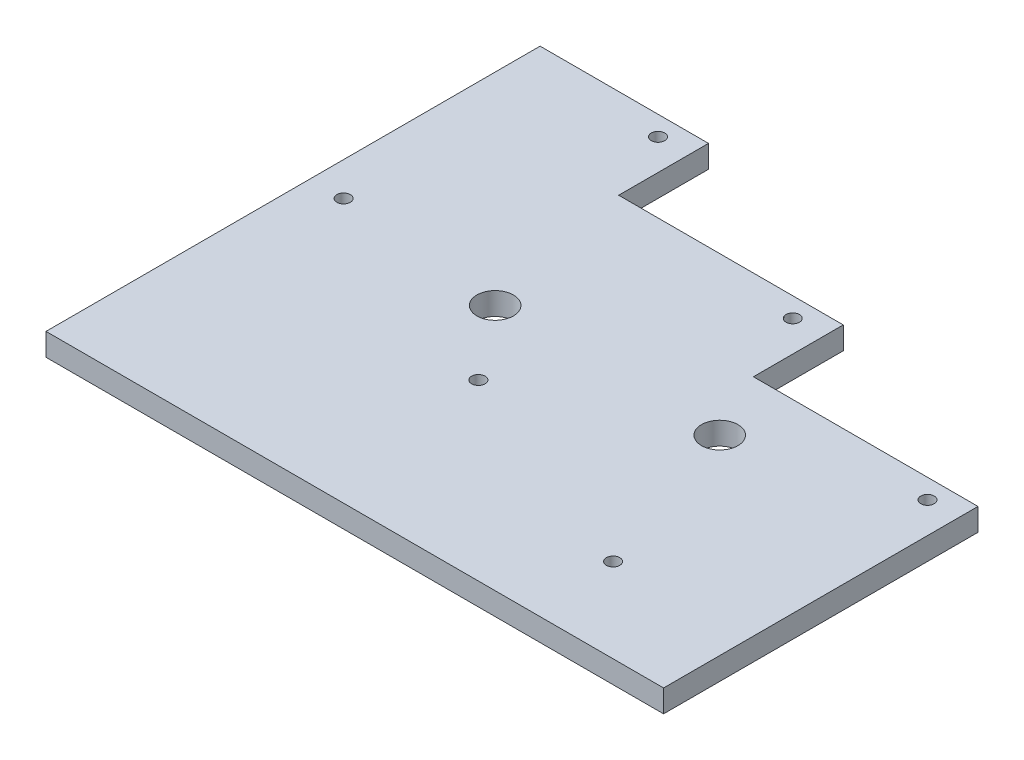
ISO-10303-21;
HEADER;
FILE_DESCRIPTION(('STEP AP214'),'2;1');
FILE_NAME('part.step','',(''),(''),'','','');
FILE_SCHEMA(('AUTOMOTIVE_DESIGN { 1 0 10303 214 1 1 1 1 }'));
ENDSEC;
DATA;
#1=APPLICATION_CONTEXT('core data for automotive mechanical design processes');
#2=APPLICATION_PROTOCOL_DEFINITION('international standard','automotive_design',2000,#1);
#3=PRODUCT_CONTEXT('',#1,'mechanical');
#4=PRODUCT('Part','Part','',(#3));
#5=PRODUCT_RELATED_PRODUCT_CATEGORY('part','',(#4));
#6=PRODUCT_DEFINITION_FORMATION('','',#4);
#7=PRODUCT_DEFINITION_CONTEXT('part definition',#1,'design');
#8=PRODUCT_DEFINITION('design','',#6,#7);
#9=PRODUCT_DEFINITION_SHAPE('','',#8);
#10=(LENGTH_UNIT() NAMED_UNIT(*) SI_UNIT(.MILLI.,.METRE.));
#11=(NAMED_UNIT(*) PLANE_ANGLE_UNIT() SI_UNIT($,.RADIAN.));
#12=(NAMED_UNIT(*) SI_UNIT($,.STERADIAN.) SOLID_ANGLE_UNIT());
#13=UNCERTAINTY_MEASURE_WITH_UNIT(LENGTH_MEASURE(1.E-05),#10,'distance_accuracy_value','');
#14=(GEOMETRIC_REPRESENTATION_CONTEXT(3) GLOBAL_UNCERTAINTY_ASSIGNED_CONTEXT((#13)) GLOBAL_UNIT_ASSIGNED_CONTEXT((#10,
#11,#12)) REPRESENTATION_CONTEXT('',''));
#15=CARTESIAN_POINT('',(0.,0.,0.));
#16=DIRECTION('',(0.,0.,1.));
#17=DIRECTION('',(1.,0.,0.));
#18=AXIS2_PLACEMENT_3D('',#15,#16,#17);
#19=CARTESIAN_POINT('',(-87.3125,3.175,-69.85));
#20=DIRECTION('',(1.,0.,0.));
#21=DIRECTION('',(0.,0.,-1.));
#22=AXIS2_PLACEMENT_3D('',#19,#20,#21);
#23=PLANE('',#22);
#24=DIRECTION('',(0.,0.,1.));
#25=VECTOR('',#24,1.);
#26=CARTESIAN_POINT('',(-87.3125,-3.175,-69.85));
#27=LINE('',#26,#25);
#28=CARTESIAN_POINT('',(-87.3125,-3.175,-69.85));
#29=VERTEX_POINT('',#28);
#30=CARTESIAN_POINT('',(-87.3125,-3.175,69.85));
#31=VERTEX_POINT('',#30);
#32=EDGE_CURVE('E141',#29,#31,#27,.T.);
#33=ORIENTED_EDGE('',*,*,#32,.T.);
#34=DIRECTION('',(0.,-1.,0.));
#35=VECTOR('',#34,1.);
#36=CARTESIAN_POINT('',(-87.3125,3.175,69.85));
#37=LINE('',#36,#35);
#38=CARTESIAN_POINT('',(-87.3125,3.175,69.85));
#39=VERTEX_POINT('',#38);
#40=EDGE_CURVE('E11',#39,#31,#37,.T.);
#41=ORIENTED_EDGE('',*,*,#40,.F.);
#42=DIRECTION('',(0.,0.,1.));
#43=VECTOR('',#42,1.);
#44=CARTESIAN_POINT('',(-87.3125,3.175,-69.85));
#45=LINE('',#44,#43);
#46=CARTESIAN_POINT('',(-87.3125,3.175,-69.85));
#47=VERTEX_POINT('',#46);
#48=EDGE_CURVE('E156',#47,#39,#45,.T.);
#49=ORIENTED_EDGE('',*,*,#48,.F.);
#50=DIRECTION('',(0.,-1.,0.));
#51=VECTOR('',#50,1.);
#52=CARTESIAN_POINT('',(-87.3125,3.175,-69.85));
#53=LINE('',#52,#51);
#54=EDGE_CURVE('E137',#47,#29,#53,.T.);
#55=ORIENTED_EDGE('',*,*,#54,.T.);
#56=EDGE_LOOP('',(#33,#41,#49,#55));
#57=FACE_BOUND('',#56,.T.);
#58=ADVANCED_FACE('F43',(#57),#23,.F.);
#59=CARTESIAN_POINT('',(-87.3125,3.175,69.85));
#60=DIRECTION('',(0.,0.,-1.));
#61=DIRECTION('',(-1.,0.,0.));
#62=AXIS2_PLACEMENT_3D('',#59,#60,#61);
#63=PLANE('',#62);
#64=DIRECTION('',(1.,0.,0.));
#65=VECTOR('',#64,1.);
#66=CARTESIAN_POINT('',(-87.3125,-3.175,69.85));
#67=LINE('',#66,#65);
#68=CARTESIAN_POINT('',(87.3125,-3.175,69.85));
#69=VERTEX_POINT('',#68);
#70=EDGE_CURVE('E144',#31,#69,#67,.T.);
#71=ORIENTED_EDGE('',*,*,#70,.T.);
#72=DIRECTION('',(0.,-1.,0.));
#73=VECTOR('',#72,1.);
#74=CARTESIAN_POINT('',(87.3125,3.175,69.85));
#75=LINE('',#74,#73);
#76=CARTESIAN_POINT('',(87.3125,3.175,69.85));
#77=VERTEX_POINT('',#76);
#78=EDGE_CURVE('E52',#77,#69,#75,.T.);
#79=ORIENTED_EDGE('',*,*,#78,.F.);
#80=DIRECTION('',(1.,0.,0.));
#81=VECTOR('',#80,1.);
#82=CARTESIAN_POINT('',(-87.3125,3.175,69.85));
#83=LINE('',#82,#81);
#84=EDGE_CURVE('E104',#39,#77,#83,.T.);
#85=ORIENTED_EDGE('',*,*,#84,.F.);
#86=ORIENTED_EDGE('',*,*,#40,.T.);
#87=EDGE_LOOP('',(#71,#79,#85,#86));
#88=FACE_BOUND('',#87,.T.);
#89=ADVANCED_FACE('F233',(#88),#63,.F.);
#90=CARTESIAN_POINT('',(87.3125,3.175,69.85));
#91=DIRECTION('',(-1.,0.,0.));
#92=DIRECTION('',(0.,0.,1.));
#93=AXIS2_PLACEMENT_3D('',#90,#91,#92);
#94=PLANE('',#93);
#95=DIRECTION('',(0.,0.,-1.));
#96=VECTOR('',#95,1.);
#97=CARTESIAN_POINT('',(87.3125,-3.175,69.85));
#98=LINE('',#97,#96);
#99=CARTESIAN_POINT('',(87.3125,-3.175,-19.05));
#100=VERTEX_POINT('',#99);
#101=EDGE_CURVE('E147',#69,#100,#98,.T.);
#102=ORIENTED_EDGE('',*,*,#101,.T.);
#103=DIRECTION('',(0.,-1.,0.));
#104=VECTOR('',#103,1.);
#105=CARTESIAN_POINT('',(87.3125,3.175,-19.05));
#106=LINE('',#105,#104);
#107=CARTESIAN_POINT('',(87.3125,3.175,-19.05));
#108=VERTEX_POINT('',#107);
#109=EDGE_CURVE('E163',#108,#100,#106,.T.);
#110=ORIENTED_EDGE('',*,*,#109,.F.);
#111=DIRECTION('',(0.,0.,-1.));
#112=VECTOR('',#111,1.);
#113=CARTESIAN_POINT('',(87.3125,3.175,69.85));
#114=LINE('',#113,#112);
#115=EDGE_CURVE('E200',#77,#108,#114,.T.);
#116=ORIENTED_EDGE('',*,*,#115,.F.);
#117=ORIENTED_EDGE('',*,*,#78,.T.);
#118=EDGE_LOOP('',(#102,#110,#116,#117));
#119=FACE_BOUND('',#118,.T.);
#120=ADVANCED_FACE('F237',(#119),#94,.F.);
#121=CARTESIAN_POINT('',(87.3125,3.175,-19.05));
#122=DIRECTION('',(0.,0.,1.));
#123=DIRECTION('',(1.,0.,0.));
#124=AXIS2_PLACEMENT_3D('',#121,#122,#123);
#125=PLANE('',#124);
#126=DIRECTION('',(-1.,0.,0.));
#127=VECTOR('',#126,1.);
#128=CARTESIAN_POINT('',(87.3125,-3.175,-19.05));
#129=LINE('',#128,#127);
#130=CARTESIAN_POINT('',(23.8125,-3.175,-19.05));
#131=VERTEX_POINT('',#130);
#132=EDGE_CURVE('E149',#100,#131,#129,.T.);
#133=ORIENTED_EDGE('',*,*,#132,.T.);
#134=DIRECTION('',(0.,-1.,0.));
#135=VECTOR('',#134,1.);
#136=CARTESIAN_POINT('',(23.8125,3.175,-19.05));
#137=LINE('',#136,#135);
#138=CARTESIAN_POINT('',(23.8125,3.175,-19.05));
#139=VERTEX_POINT('',#138);
#140=EDGE_CURVE('E160',#139,#131,#137,.T.);
#141=ORIENTED_EDGE('',*,*,#140,.F.);
#142=DIRECTION('',(-1.,0.,0.));
#143=VECTOR('',#142,1.);
#144=CARTESIAN_POINT('',(87.3125,3.175,-19.05));
#145=LINE('',#144,#143);
#146=EDGE_CURVE('E202',#108,#139,#145,.T.);
#147=ORIENTED_EDGE('',*,*,#146,.F.);
#148=ORIENTED_EDGE('',*,*,#109,.T.);
#149=EDGE_LOOP('',(#133,#141,#147,#148));
#150=FACE_BOUND('',#149,.T.);
#151=ADVANCED_FACE('F208',(#150),#125,.F.);
#152=CARTESIAN_POINT('',(23.8125,3.175,-19.05));
#153=DIRECTION('',(-1.,0.,0.));
#154=DIRECTION('',(0.,0.,1.));
#155=AXIS2_PLACEMENT_3D('',#152,#153,#154);
#156=PLANE('',#155);
#157=DIRECTION('',(0.,0.,-1.));
#158=VECTOR('',#157,1.);
#159=CARTESIAN_POINT('',(23.8125,-3.175,-19.05));
#160=LINE('',#159,#158);
#161=CARTESIAN_POINT('',(23.8125,-3.175,-44.45));
#162=VERTEX_POINT('',#161);
#163=EDGE_CURVE('E151',#131,#162,#160,.T.);
#164=ORIENTED_EDGE('',*,*,#163,.T.);
#165=DIRECTION('',(0.,-1.,0.));
#166=VECTOR('',#165,1.);
#167=CARTESIAN_POINT('',(23.8125,3.175,-44.45));
#168=LINE('',#167,#166);
#169=CARTESIAN_POINT('',(23.8125,3.175,-44.45));
#170=VERTEX_POINT('',#169);
#171=EDGE_CURVE('E132',#170,#162,#168,.T.);
#172=ORIENTED_EDGE('',*,*,#171,.F.);
#173=DIRECTION('',(0.,0.,-1.));
#174=VECTOR('',#173,1.);
#175=CARTESIAN_POINT('',(23.8125,3.175,-19.05));
#176=LINE('',#175,#174);
#177=EDGE_CURVE('E123',#139,#170,#176,.T.);
#178=ORIENTED_EDGE('',*,*,#177,.F.);
#179=ORIENTED_EDGE('',*,*,#140,.T.);
#180=EDGE_LOOP('',(#164,#172,#178,#179));
#181=FACE_BOUND('',#180,.T.);
#182=ADVANCED_FACE('F212',(#181),#156,.F.);
#183=CARTESIAN_POINT('',(23.8125,3.175,-44.45));
#184=DIRECTION('',(0.,0.,1.));
#185=DIRECTION('',(1.,0.,0.));
#186=AXIS2_PLACEMENT_3D('',#183,#184,#185);
#187=PLANE('',#186);
#188=DIRECTION('',(-1.,0.,0.));
#189=VECTOR('',#188,1.);
#190=CARTESIAN_POINT('',(23.8125,-3.175,-44.45));
#191=LINE('',#190,#189);
#192=CARTESIAN_POINT('',(-39.6875,-3.175,-44.45));
#193=VERTEX_POINT('',#192);
#194=EDGE_CURVE('E131',#162,#193,#191,.T.);
#195=ORIENTED_EDGE('',*,*,#194,.T.);
#196=DIRECTION('',(0.,-1.,0.));
#197=VECTOR('',#196,1.);
#198=CARTESIAN_POINT('',(-39.6875,3.175,-44.45));
#199=LINE('',#198,#197);
#200=CARTESIAN_POINT('',(-39.6875,3.175,-44.45));
#201=VERTEX_POINT('',#200);
#202=EDGE_CURVE('E128',#201,#193,#199,.T.);
#203=ORIENTED_EDGE('',*,*,#202,.F.);
#204=DIRECTION('',(-1.,0.,0.));
#205=VECTOR('',#204,1.);
#206=CARTESIAN_POINT('',(23.8125,3.175,-44.45));
#207=LINE('',#206,#205);
#208=EDGE_CURVE('E117',#170,#201,#207,.T.);
#209=ORIENTED_EDGE('',*,*,#208,.F.);
#210=ORIENTED_EDGE('',*,*,#171,.T.);
#211=EDGE_LOOP('',(#195,#203,#209,#210));
#212=FACE_BOUND('',#211,.T.);
#213=ADVANCED_FACE('F129',(#212),#187,.F.);
#214=CARTESIAN_POINT('',(-39.6875,3.175,-44.45));
#215=DIRECTION('',(-1.,0.,0.));
#216=DIRECTION('',(0.,0.,1.));
#217=AXIS2_PLACEMENT_3D('',#214,#215,#216);
#218=PLANE('',#217);
#219=DIRECTION('',(0.,0.,-1.));
#220=VECTOR('',#219,1.);
#221=CARTESIAN_POINT('',(-39.6875,-3.175,-44.45));
#222=LINE('',#221,#220);
#223=CARTESIAN_POINT('',(-39.6875,-3.175,-69.85));
#224=VERTEX_POINT('',#223);
#225=EDGE_CURVE('E90',#193,#224,#222,.T.);
#226=ORIENTED_EDGE('',*,*,#225,.T.);
#227=DIRECTION('',(0.,-1.,0.));
#228=VECTOR('',#227,1.);
#229=CARTESIAN_POINT('',(-39.6875,3.175,-69.85));
#230=LINE('',#229,#228);
#231=CARTESIAN_POINT('',(-39.6875,3.175,-69.85));
#232=VERTEX_POINT('',#231);
#233=EDGE_CURVE('E133',#232,#224,#230,.T.);
#234=ORIENTED_EDGE('',*,*,#233,.F.);
#235=DIRECTION('',(0.,0.,-1.));
#236=VECTOR('',#235,1.);
#237=CARTESIAN_POINT('',(-39.6875,3.175,-44.45));
#238=LINE('',#237,#236);
#239=EDGE_CURVE('E121',#201,#232,#238,.T.);
#240=ORIENTED_EDGE('',*,*,#239,.F.);
#241=ORIENTED_EDGE('',*,*,#202,.T.);
#242=EDGE_LOOP('',(#226,#234,#240,#241));
#243=FACE_BOUND('',#242,.T.);
#244=ADVANCED_FACE('F135',(#243),#218,.F.);
#245=CARTESIAN_POINT('',(-39.6875,3.175,-69.85));
#246=DIRECTION('',(0.,0.,1.));
#247=DIRECTION('',(1.,0.,0.));
#248=AXIS2_PLACEMENT_3D('',#245,#246,#247);
#249=PLANE('',#248);
#250=DIRECTION('',(-1.,0.,0.));
#251=VECTOR('',#250,1.);
#252=CARTESIAN_POINT('',(-39.6875,-3.175,-69.85));
#253=LINE('',#252,#251);
#254=EDGE_CURVE('E96',#224,#29,#253,.T.);
#255=ORIENTED_EDGE('',*,*,#254,.T.);
#256=ORIENTED_EDGE('',*,*,#54,.F.);
#257=DIRECTION('',(-1.,0.,0.));
#258=VECTOR('',#257,1.);
#259=CARTESIAN_POINT('',(-39.6875,3.175,-69.85));
#260=LINE('',#259,#258);
#261=EDGE_CURVE('E61',#232,#47,#260,.T.);
#262=ORIENTED_EDGE('',*,*,#261,.F.);
#263=ORIENTED_EDGE('',*,*,#233,.T.);
#264=EDGE_LOOP('',(#255,#256,#262,#263));
#265=FACE_BOUND('',#264,.T.);
#266=ADVANCED_FACE('F220',(#265),#249,.F.);
#267=CARTESIAN_POINT('',(0.,3.175,0.));
#268=DIRECTION('',(0.,1.,0.));
#269=DIRECTION('',(0.,0.,1.));
#270=AXIS2_PLACEMENT_3D('',#267,#268,#269);
#271=PLANE('',#270);
#272=CARTESIAN_POINT('',(-77.7875,3.175,-4.7752));
#273=DIRECTION('',(0.,1.,0.));
#274=DIRECTION('',(0.,0.,1.));
#275=AXIS2_PLACEMENT_3D('',#272,#273,#274);
#276=CIRCLE('',#275,1.89865);
#277=CARTESIAN_POINT('',(-77.7875,3.175,-2.87655));
#278=VERTEX_POINT('',#277);
#279=EDGE_CURVE('E172',#278,#278,#276,.T.);
#280=ORIENTED_EDGE('',*,*,#279,.F.);
#281=EDGE_LOOP('',(#280));
#282=FACE_BOUND('',#281,.T.);
#283=CARTESIAN_POINT('',(-48.4251,3.175,-64.3128));
#284=DIRECTION('',(0.,1.,0.));
#285=DIRECTION('',(0.,0.,1.));
#286=AXIS2_PLACEMENT_3D('',#283,#284,#285);
#287=CIRCLE('',#286,1.89865);
#288=CARTESIAN_POINT('',(-48.4251,3.175,-62.41415));
#289=VERTEX_POINT('',#288);
#290=EDGE_CURVE('E361',#289,#289,#287,.T.);
#291=ORIENTED_EDGE('',*,*,#290,.F.);
#292=EDGE_LOOP('',(#291));
#293=FACE_BOUND('',#292,.T.);
#294=CARTESIAN_POINT('',(-14.2875,3.175,20.6248));
#295=DIRECTION('',(0.,1.,0.));
#296=DIRECTION('',(0.,0.,1.));
#297=AXIS2_PLACEMENT_3D('',#294,#295,#296);
#298=CIRCLE('',#297,1.89865);
#299=CARTESIAN_POINT('',(-14.2875,3.175,22.52345));
#300=VERTEX_POINT('',#299);
#301=EDGE_CURVE('E364',#300,#300,#298,.T.);
#302=ORIENTED_EDGE('',*,*,#301,.F.);
#303=EDGE_LOOP('',(#302));
#304=FACE_BOUND('',#303,.T.);
#305=CARTESIAN_POINT('',(15.0749,3.175,-38.9128));
#306=DIRECTION('',(0.,1.,0.));
#307=DIRECTION('',(0.,0.,1.));
#308=AXIS2_PLACEMENT_3D('',#305,#306,#307);
#309=CIRCLE('',#308,1.89865);
#310=CARTESIAN_POINT('',(15.0749,3.175,-37.01415));
#311=VERTEX_POINT('',#310);
#312=EDGE_CURVE('E369',#311,#311,#309,.T.);
#313=ORIENTED_EDGE('',*,*,#312,.F.);
#314=EDGE_LOOP('',(#313));
#315=FACE_BOUND('',#314,.T.);
#316=CARTESIAN_POINT('',(49.2125,3.175,46.0248));
#317=DIRECTION('',(0.,1.,0.));
#318=DIRECTION('',(0.,0.,1.));
#319=AXIS2_PLACEMENT_3D('',#316,#317,#318);
#320=CIRCLE('',#319,1.89865);
#321=CARTESIAN_POINT('',(49.2125,3.175,47.92345));
#322=VERTEX_POINT('',#321);
#323=EDGE_CURVE('E372',#322,#322,#320,.T.);
#324=ORIENTED_EDGE('',*,*,#323,.F.);
#325=EDGE_LOOP('',(#324));
#326=FACE_BOUND('',#325,.T.);
#327=CARTESIAN_POINT('',(78.5749,3.175,-13.5128));
#328=DIRECTION('',(0.,1.,0.));
#329=DIRECTION('',(0.,0.,1.));
#330=AXIS2_PLACEMENT_3D('',#327,#328,#329);
#331=CIRCLE('',#330,1.89865);
#332=CARTESIAN_POINT('',(78.5749,3.175,-11.61415));
#333=VERTEX_POINT('',#332);
#334=EDGE_CURVE('E375',#333,#333,#331,.T.);
#335=ORIENTED_EDGE('',*,*,#334,.F.);
#336=EDGE_LOOP('',(#335));
#337=FACE_BOUND('',#336,.T.);
#338=CARTESIAN_POINT('',(-30.1625,3.175,0.));
#339=DIRECTION('',(0.,1.,0.));
#340=DIRECTION('',(0.,0.,1.));
#341=AXIS2_PLACEMENT_3D('',#338,#339,#340);
#342=CIRCLE('',#341,5.1562);
#343=CARTESIAN_POINT('',(-30.1625,3.175,5.1562));
#344=VERTEX_POINT('',#343);
#345=EDGE_CURVE('E194',#344,#344,#342,.T.);
#346=ORIENTED_EDGE('',*,*,#345,.F.);
#347=EDGE_LOOP('',(#346));
#348=FACE_BOUND('',#347,.T.);
#349=CARTESIAN_POINT('',(33.3375,3.175,0.));
#350=DIRECTION('',(0.,1.,0.));
#351=DIRECTION('',(0.,0.,1.));
#352=AXIS2_PLACEMENT_3D('',#349,#350,#351);
#353=CIRCLE('',#352,5.1562);
#354=CARTESIAN_POINT('',(33.3375,3.175,5.1562));
#355=VERTEX_POINT('',#354);
#356=EDGE_CURVE('E189',#355,#355,#353,.T.);
#357=ORIENTED_EDGE('',*,*,#356,.F.);
#358=EDGE_LOOP('',(#357));
#359=FACE_BOUND('',#358,.T.);
#360=ORIENTED_EDGE('',*,*,#48,.T.);
#361=ORIENTED_EDGE('',*,*,#84,.T.);
#362=ORIENTED_EDGE('',*,*,#115,.T.);
#363=ORIENTED_EDGE('',*,*,#146,.T.);
#364=ORIENTED_EDGE('',*,*,#177,.T.);
#365=ORIENTED_EDGE('',*,*,#208,.T.);
#366=ORIENTED_EDGE('',*,*,#239,.T.);
#367=ORIENTED_EDGE('',*,*,#261,.T.);
#368=EDGE_LOOP('',(#360,#361,#362,#363,#364,#365,#366,#367));
#369=FACE_BOUND('',#368,.T.);
#370=ADVANCED_FACE('F119',(#282,#293,#304,#315,#326,#337,#348,#359,#369),#271,.T.);
#371=CARTESIAN_POINT('',(0.,-3.175,0.));
#372=DIRECTION('',(0.,1.,0.));
#373=DIRECTION('',(0.,0.,1.));
#374=AXIS2_PLACEMENT_3D('',#371,#372,#373);
#375=PLANE('',#374);
#376=CARTESIAN_POINT('',(-77.7875,-3.175,-4.7752));
#377=DIRECTION('',(0.,1.,0.));
#378=DIRECTION('',(0.,0.,1.));
#379=AXIS2_PLACEMENT_3D('',#376,#377,#378);
#380=CIRCLE('',#379,1.89865);
#381=CARTESIAN_POINT('',(-77.7875,-3.175,-2.87655));
#382=VERTEX_POINT('',#381);
#383=EDGE_CURVE('E46',#382,#382,#380,.T.);
#384=ORIENTED_EDGE('',*,*,#383,.T.);
#385=EDGE_LOOP('',(#384));
#386=FACE_BOUND('',#385,.T.);
#387=CARTESIAN_POINT('',(-48.4251,-3.175,-64.3128));
#388=DIRECTION('',(0.,1.,0.));
#389=DIRECTION('',(0.,0.,1.));
#390=AXIS2_PLACEMENT_3D('',#387,#388,#389);
#391=CIRCLE('',#390,1.89865);
#392=CARTESIAN_POINT('',(-48.4251,-3.175,-62.41415));
#393=VERTEX_POINT('',#392);
#394=EDGE_CURVE('E180',#393,#393,#391,.T.);
#395=ORIENTED_EDGE('',*,*,#394,.T.);
#396=EDGE_LOOP('',(#395));
#397=FACE_BOUND('',#396,.T.);
#398=CARTESIAN_POINT('',(-14.2875,-3.175,20.6248));
#399=DIRECTION('',(0.,1.,0.));
#400=DIRECTION('',(0.,0.,1.));
#401=AXIS2_PLACEMENT_3D('',#398,#399,#400);
#402=CIRCLE('',#401,1.89865);
#403=CARTESIAN_POINT('',(-14.2875,-3.175,22.52345));
#404=VERTEX_POINT('',#403);
#405=EDGE_CURVE('E178',#404,#404,#402,.T.);
#406=ORIENTED_EDGE('',*,*,#405,.T.);
#407=EDGE_LOOP('',(#406));
#408=FACE_BOUND('',#407,.T.);
#409=CARTESIAN_POINT('',(15.0749,-3.175,-38.9128));
#410=DIRECTION('',(0.,1.,0.));
#411=DIRECTION('',(0.,0.,1.));
#412=AXIS2_PLACEMENT_3D('',#409,#410,#411);
#413=CIRCLE('',#412,1.89865);
#414=CARTESIAN_POINT('',(15.0749,-3.175,-37.01415));
#415=VERTEX_POINT('',#414);
#416=EDGE_CURVE('E175',#415,#415,#413,.T.);
#417=ORIENTED_EDGE('',*,*,#416,.T.);
#418=EDGE_LOOP('',(#417));
#419=FACE_BOUND('',#418,.T.);
#420=CARTESIAN_POINT('',(49.2125,-3.175,46.0248));
#421=DIRECTION('',(0.,1.,0.));
#422=DIRECTION('',(0.,0.,1.));
#423=AXIS2_PLACEMENT_3D('',#420,#421,#422);
#424=CIRCLE('',#423,1.89865);
#425=CARTESIAN_POINT('',(49.2125,-3.175,47.92345));
#426=VERTEX_POINT('',#425);
#427=EDGE_CURVE('E171',#426,#426,#424,.T.);
#428=ORIENTED_EDGE('',*,*,#427,.T.);
#429=EDGE_LOOP('',(#428));
#430=FACE_BOUND('',#429,.T.);
#431=CARTESIAN_POINT('',(78.5749,-3.175,-13.5128));
#432=DIRECTION('',(0.,1.,0.));
#433=DIRECTION('',(0.,0.,1.));
#434=AXIS2_PLACEMENT_3D('',#431,#432,#433);
#435=CIRCLE('',#434,1.89865);
#436=CARTESIAN_POINT('',(78.5749,-3.175,-11.61415));
#437=VERTEX_POINT('',#436);
#438=EDGE_CURVE('E168',#437,#437,#435,.T.);
#439=ORIENTED_EDGE('',*,*,#438,.T.);
#440=EDGE_LOOP('',(#439));
#441=FACE_BOUND('',#440,.T.);
#442=CARTESIAN_POINT('',(-30.1625,-3.175,0.));
#443=DIRECTION('',(0.,1.,0.));
#444=DIRECTION('',(0.,0.,1.));
#445=AXIS2_PLACEMENT_3D('',#442,#443,#444);
#446=CIRCLE('',#445,5.1562);
#447=CARTESIAN_POINT('',(-30.1625,-3.175,5.1562));
#448=VERTEX_POINT('',#447);
#449=EDGE_CURVE('E145',#448,#448,#446,.T.);
#450=ORIENTED_EDGE('',*,*,#449,.T.);
#451=EDGE_LOOP('',(#450));
#452=FACE_BOUND('',#451,.T.);
#453=CARTESIAN_POINT('',(33.3375,-3.175,0.));
#454=DIRECTION('',(0.,1.,0.));
#455=DIRECTION('',(0.,0.,1.));
#456=AXIS2_PLACEMENT_3D('',#453,#454,#455);
#457=CIRCLE('',#456,5.1562);
#458=CARTESIAN_POINT('',(33.3375,-3.175,5.1562));
#459=VERTEX_POINT('',#458);
#460=EDGE_CURVE('E185',#459,#459,#457,.T.);
#461=ORIENTED_EDGE('',*,*,#460,.T.);
#462=EDGE_LOOP('',(#461));
#463=FACE_BOUND('',#462,.T.);
#464=ORIENTED_EDGE('',*,*,#32,.F.);
#465=ORIENTED_EDGE('',*,*,#254,.F.);
#466=ORIENTED_EDGE('',*,*,#225,.F.);
#467=ORIENTED_EDGE('',*,*,#194,.F.);
#468=ORIENTED_EDGE('',*,*,#163,.F.);
#469=ORIENTED_EDGE('',*,*,#132,.F.);
#470=ORIENTED_EDGE('',*,*,#101,.F.);
#471=ORIENTED_EDGE('',*,*,#70,.F.);
#472=EDGE_LOOP('',(#464,#465,#466,#467,#468,#469,#470,#471));
#473=FACE_BOUND('',#472,.T.);
#474=ADVANCED_FACE('F215',(#386,#397,#408,#419,#430,#441,#452,#463,#473),#375,.F.);
#475=CARTESIAN_POINT('',(33.3375,-3.175,0.));
#476=DIRECTION('',(0.,1.,0.));
#477=DIRECTION('',(0.,0.,1.));
#478=AXIS2_PLACEMENT_3D('',#475,#476,#477);
#479=CYLINDRICAL_SURFACE('',#478,5.1562);
#480=ORIENTED_EDGE('',*,*,#460,.F.);
#481=EDGE_LOOP('',(#480));
#482=FACE_BOUND('',#481,.T.);
#483=ORIENTED_EDGE('',*,*,#356,.T.);
#484=EDGE_LOOP('',(#483));
#485=FACE_BOUND('',#484,.T.);
#486=ADVANCED_FACE('F279',(#482,#485),#479,.F.);
#487=CARTESIAN_POINT('',(-30.1625,-3.175,0.));
#488=DIRECTION('',(0.,1.,0.));
#489=DIRECTION('',(0.,0.,1.));
#490=AXIS2_PLACEMENT_3D('',#487,#488,#489);
#491=CYLINDRICAL_SURFACE('',#490,5.1562);
#492=ORIENTED_EDGE('',*,*,#449,.F.);
#493=EDGE_LOOP('',(#492));
#494=FACE_BOUND('',#493,.T.);
#495=ORIENTED_EDGE('',*,*,#345,.T.);
#496=EDGE_LOOP('',(#495));
#497=FACE_BOUND('',#496,.T.);
#498=ADVANCED_FACE('F287',(#494,#497),#491,.F.);
#499=CARTESIAN_POINT('',(78.5749,-9.525,-13.5128));
#500=DIRECTION('',(0.,1.,0.));
#501=DIRECTION('',(0.,0.,1.));
#502=AXIS2_PLACEMENT_3D('',#499,#500,#501);
#503=CYLINDRICAL_SURFACE('',#502,1.89865);
#504=ORIENTED_EDGE('',*,*,#334,.T.);
#505=EDGE_LOOP('',(#504));
#506=FACE_BOUND('',#505,.T.);
#507=ORIENTED_EDGE('',*,*,#438,.F.);
#508=EDGE_LOOP('',(#507));
#509=FACE_BOUND('',#508,.T.);
#510=ADVANCED_FACE('F296',(#506,#509),#503,.F.);
#511=CARTESIAN_POINT('',(49.2125,-9.525,46.0248));
#512=DIRECTION('',(0.,1.,0.));
#513=DIRECTION('',(0.,0.,1.));
#514=AXIS2_PLACEMENT_3D('',#511,#512,#513);
#515=CYLINDRICAL_SURFACE('',#514,1.89865);
#516=ORIENTED_EDGE('',*,*,#323,.T.);
#517=EDGE_LOOP('',(#516));
#518=FACE_BOUND('',#517,.T.);
#519=ORIENTED_EDGE('',*,*,#427,.F.);
#520=EDGE_LOOP('',(#519));
#521=FACE_BOUND('',#520,.T.);
#522=ADVANCED_FACE('F305',(#518,#521),#515,.F.);
#523=CARTESIAN_POINT('',(15.0749,-9.525,-38.9128));
#524=DIRECTION('',(0.,1.,0.));
#525=DIRECTION('',(0.,0.,1.));
#526=AXIS2_PLACEMENT_3D('',#523,#524,#525);
#527=CYLINDRICAL_SURFACE('',#526,1.89865);
#528=ORIENTED_EDGE('',*,*,#312,.T.);
#529=EDGE_LOOP('',(#528));
#530=FACE_BOUND('',#529,.T.);
#531=ORIENTED_EDGE('',*,*,#416,.F.);
#532=EDGE_LOOP('',(#531));
#533=FACE_BOUND('',#532,.T.);
#534=ADVANCED_FACE('F315',(#530,#533),#527,.F.);
#535=CARTESIAN_POINT('',(-14.2875,-9.525,20.6248));
#536=DIRECTION('',(0.,1.,0.));
#537=DIRECTION('',(0.,0.,1.));
#538=AXIS2_PLACEMENT_3D('',#535,#536,#537);
#539=CYLINDRICAL_SURFACE('',#538,1.89865);
#540=ORIENTED_EDGE('',*,*,#301,.T.);
#541=EDGE_LOOP('',(#540));
#542=FACE_BOUND('',#541,.T.);
#543=ORIENTED_EDGE('',*,*,#405,.F.);
#544=EDGE_LOOP('',(#543));
#545=FACE_BOUND('',#544,.T.);
#546=ADVANCED_FACE('F325',(#542,#545),#539,.F.);
#547=CARTESIAN_POINT('',(-48.4251,-9.525,-64.3128));
#548=DIRECTION('',(0.,1.,0.));
#549=DIRECTION('',(0.,0.,1.));
#550=AXIS2_PLACEMENT_3D('',#547,#548,#549);
#551=CYLINDRICAL_SURFACE('',#550,1.89865);
#552=ORIENTED_EDGE('',*,*,#290,.T.);
#553=EDGE_LOOP('',(#552));
#554=FACE_BOUND('',#553,.T.);
#555=ORIENTED_EDGE('',*,*,#394,.F.);
#556=EDGE_LOOP('',(#555));
#557=FACE_BOUND('',#556,.T.);
#558=ADVANCED_FACE('F335',(#554,#557),#551,.F.);
#559=CARTESIAN_POINT('',(-77.7875,-9.525,-4.7752));
#560=DIRECTION('',(0.,1.,0.));
#561=DIRECTION('',(0.,0.,1.));
#562=AXIS2_PLACEMENT_3D('',#559,#560,#561);
#563=CYLINDRICAL_SURFACE('',#562,1.89865);
#564=ORIENTED_EDGE('',*,*,#279,.T.);
#565=EDGE_LOOP('',(#564));
#566=FACE_BOUND('',#565,.T.);
#567=ORIENTED_EDGE('',*,*,#383,.F.);
#568=EDGE_LOOP('',(#567));
#569=FACE_BOUND('',#568,.T.);
#570=ADVANCED_FACE('F345',(#566,#569),#563,.F.);
#571=CLOSED_SHELL('',(#58,#89,#120,#151,#182,#213,#244,#266,#370,#474,#486,#498,#510,#522,#534,
#546,#558,#570));
#572=MANIFOLD_SOLID_BREP('B2',#571);
#573=ADVANCED_BREP_SHAPE_REPRESENTATION('',(#18,#572),#14);
#574=SHAPE_DEFINITION_REPRESENTATION(#9,#573);
ENDSEC;
END-ISO-10303-21;
